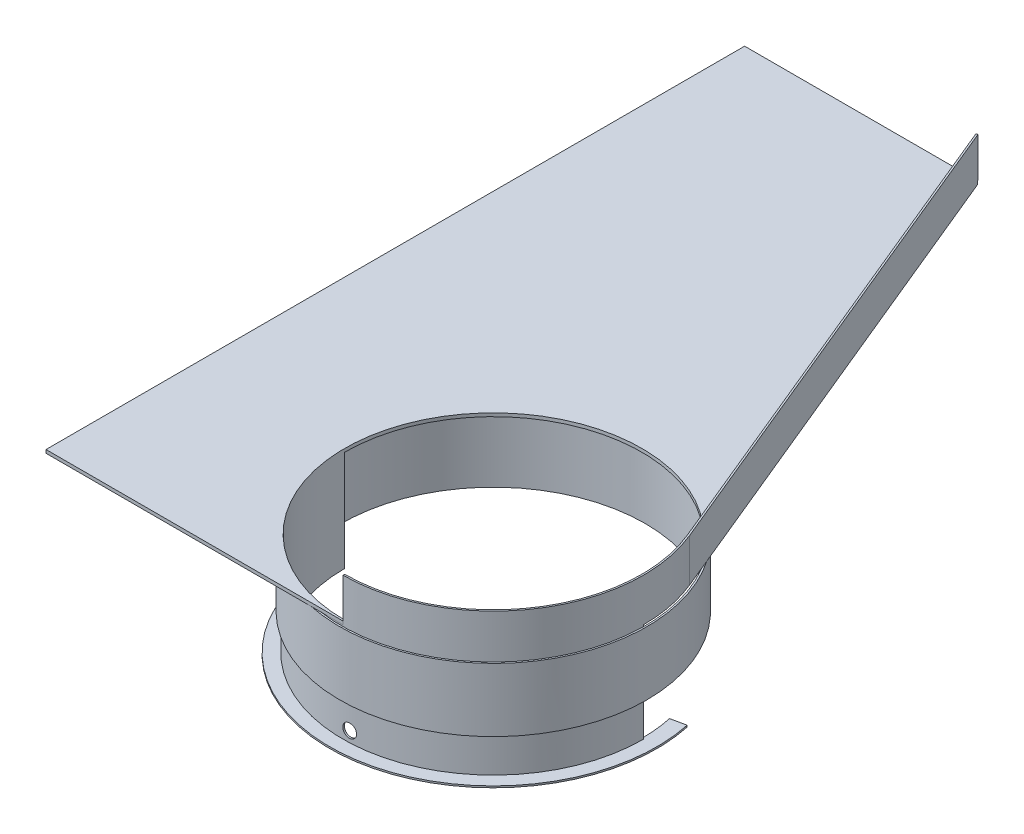
ISO-10303-21;
HEADER;
FILE_DESCRIPTION(('STEP AP214'),'2;1');
FILE_NAME('part.step','',(''),(''),'','','');
FILE_SCHEMA(('AUTOMOTIVE_DESIGN { 1 0 10303 214 1 1 1 1 }'));
ENDSEC;
DATA;
#1=APPLICATION_CONTEXT('core data for automotive mechanical design processes');
#2=APPLICATION_PROTOCOL_DEFINITION('international standard','automotive_design',2000,#1);
#3=PRODUCT_CONTEXT('',#1,'mechanical');
#4=PRODUCT('Part','Part','',(#3));
#5=PRODUCT_RELATED_PRODUCT_CATEGORY('part','',(#4));
#6=PRODUCT_DEFINITION_FORMATION('','',#4);
#7=PRODUCT_DEFINITION_CONTEXT('part definition',#1,'design');
#8=PRODUCT_DEFINITION('design','',#6,#7);
#9=PRODUCT_DEFINITION_SHAPE('','',#8);
#10=(LENGTH_UNIT() NAMED_UNIT(*) SI_UNIT(.MILLI.,.METRE.));
#11=(NAMED_UNIT(*) PLANE_ANGLE_UNIT() SI_UNIT($,.RADIAN.));
#12=(NAMED_UNIT(*) SI_UNIT($,.STERADIAN.) SOLID_ANGLE_UNIT());
#13=UNCERTAINTY_MEASURE_WITH_UNIT(LENGTH_MEASURE(1.E-05),#10,'distance_accuracy_value','');
#14=(GEOMETRIC_REPRESENTATION_CONTEXT(3) GLOBAL_UNCERTAINTY_ASSIGNED_CONTEXT((#13)) GLOBAL_UNIT_ASSIGNED_CONTEXT((#10,
#11,#12)) REPRESENTATION_CONTEXT('',''));
#15=CARTESIAN_POINT('',(0.,0.,0.));
#16=DIRECTION('',(0.,0.,1.));
#17=DIRECTION('',(1.,0.,0.));
#18=AXIS2_PLACEMENT_3D('',#15,#16,#17);
#19=CARTESIAN_POINT('',(0.,98.425,0.));
#20=DIRECTION('',(0.,-1.,0.));
#21=DIRECTION('',(0.,0.,-1.));
#22=AXIS2_PLACEMENT_3D('',#19,#20,#21);
#23=PLANE('',#22);
#24=DIRECTION('',(0.381936464594125,0.,0.924188583035595));
#25=VECTOR('',#24,1.);
#26=CARTESIAN_POINT('',(240.88481378643,98.425,-99.5496978006486));
#27=LINE('',#26,#25);
#28=CARTESIAN_POINT('',(135.067723015778,98.425,-355.600000000001));
#29=VERTEX_POINT('',#28);
#30=CARTESIAN_POINT('',(318.446478633084,98.425,88.1296985845215));
#31=VERTEX_POINT('',#30);
#32=EDGE_CURVE('E336',#29,#31,#27,.T.);
#33=ORIENTED_EDGE('',*,*,#32,.T.);
#34=CARTESIAN_POINT('',(196.567199105005,98.425,171.45));
#35=DIRECTION('',(0.,-1.,0.));
#36=DIRECTION('',(1.,0.,0.));
#37=AXIS2_PLACEMENT_3D('',#34,#35,#36);
#38=CIRCLE('',#37,147.6375);
#39=CARTESIAN_POINT('',(166.113668931969,98.425,315.9125));
#40=VERTEX_POINT('',#39);
#41=EDGE_CURVE('E392',#40,#31,#38,.T.);
#42=ORIENTED_EDGE('',*,*,#41,.F.);
#43=DIRECTION('',(-1.,0.,0.));
#44=VECTOR('',#43,1.);
#45=CARTESIAN_POINT('',(0.,98.425,315.9125));
#46=LINE('',#45,#44);
#47=CARTESIAN_POINT('',(-88.9,98.425,315.9125));
#48=VERTEX_POINT('',#47);
#49=EDGE_CURVE('E113',#40,#48,#46,.T.);
#50=ORIENTED_EDGE('',*,*,#49,.T.);
#51=DIRECTION('',(0.,0.,1.));
#52=VECTOR('',#51,1.);
#53=CARTESIAN_POINT('',(-88.9,98.425,0.));
#54=LINE('',#53,#52);
#55=CARTESIAN_POINT('',(-88.9,98.425,-355.6));
#56=VERTEX_POINT('',#55);
#57=EDGE_CURVE('E449',#56,#48,#54,.T.);
#58=ORIENTED_EDGE('',*,*,#57,.F.);
#59=DIRECTION('',(-1.,0.,0.));
#60=VECTOR('',#59,1.);
#61=CARTESIAN_POINT('',(-88.9,98.425,-355.6));
#62=LINE('',#61,#60);
#63=EDGE_CURVE('E451',#29,#56,#62,.T.);
#64=ORIENTED_EDGE('',*,*,#63,.F.);
#65=EDGE_LOOP('',(#33,#42,#50,#58,#64));
#66=FACE_BOUND('',#65,.T.);
#67=ADVANCED_FACE('F51',(#66),#23,.T.);
#68=CARTESIAN_POINT('',(0.,101.6,0.));
#69=DIRECTION('',(0.,-1.,0.));
#70=DIRECTION('',(0.,0.,-1.));
#71=AXIS2_PLACEMENT_3D('',#68,#69,#70);
#72=PLANE('',#71);
#73=DIRECTION('',(0.,0.,1.));
#74=VECTOR('',#73,1.);
#75=CARTESIAN_POINT('',(-88.9,101.6,0.));
#76=LINE('',#75,#74);
#77=CARTESIAN_POINT('',(-88.9,101.6,-355.6));
#78=VERTEX_POINT('',#77);
#79=CARTESIAN_POINT('',(-88.9,101.6,315.9125));
#80=VERTEX_POINT('',#79);
#81=EDGE_CURVE('E439',#78,#80,#76,.T.);
#82=ORIENTED_EDGE('',*,*,#81,.T.);
#83=DIRECTION('',(-1.,0.,0.));
#84=VECTOR('',#83,1.);
#85=CARTESIAN_POINT('',(0.,101.6,315.9125));
#86=LINE('',#85,#84);
#87=CARTESIAN_POINT('',(196.567199105005,101.6,315.9125));
#88=VERTEX_POINT('',#87);
#89=EDGE_CURVE('E206',#88,#80,#86,.T.);
#90=ORIENTED_EDGE('',*,*,#89,.F.);
#91=DIRECTION('',(0.,0.,-1.));
#92=VECTOR('',#91,1.);
#93=CARTESIAN_POINT('',(196.567199105005,101.6,315.9125));
#94=LINE('',#93,#92);
#95=CARTESIAN_POINT('',(196.567199105005,101.6,314.325));
#96=VERTEX_POINT('',#95);
#97=EDGE_CURVE('E434',#88,#96,#94,.T.);
#98=ORIENTED_EDGE('',*,*,#97,.T.);
#99=CARTESIAN_POINT('',(196.567199105005,101.6,171.45));
#100=DIRECTION('',(0.,1.,0.));
#101=DIRECTION('',(0.,0.,1.));
#102=AXIS2_PLACEMENT_3D('',#99,#100,#101);
#103=CIRCLE('',#102,142.875);
#104=CARTESIAN_POINT('',(328.610642906215,101.6,116.880827621114));
#105=VERTEX_POINT('',#104);
#106=EDGE_CURVE('E404',#105,#96,#103,.T.);
#107=ORIENTED_EDGE('',*,*,#106,.F.);
#108=DIRECTION('',(0.381936464594125,0.,0.924188583035595));
#109=VECTOR('',#108,1.);
#110=CARTESIAN_POINT('',(328.610642906215,101.6,116.880827621114));
#111=LINE('',#110,#109);
#112=CARTESIAN_POINT('',(133.35,101.6,-355.6));
#113=VERTEX_POINT('',#112);
#114=EDGE_CURVE('E460',#113,#105,#111,.T.);
#115=ORIENTED_EDGE('',*,*,#114,.F.);
#116=DIRECTION('',(-1.,0.,0.));
#117=VECTOR('',#116,1.);
#118=CARTESIAN_POINT('',(-88.9,101.6,-355.6));
#119=LINE('',#118,#117);
#120=EDGE_CURVE('E438',#113,#78,#119,.T.);
#121=ORIENTED_EDGE('',*,*,#120,.T.);
#122=EDGE_LOOP('',(#82,#90,#98,#107,#115,#121));
#123=FACE_BOUND('',#122,.T.);
#124=ADVANCED_FACE('F240',(#123),#72,.F.);
#125=CARTESIAN_POINT('',(-88.9,101.6,-355.6));
#126=DIRECTION('',(0.,0.,1.));
#127=DIRECTION('',(1.,0.,0.));
#128=AXIS2_PLACEMENT_3D('',#125,#126,#127);
#129=PLANE('',#128);
#130=CARTESIAN_POINT('',(135.067723015778,101.6,-355.600000000001));
#131=VERTEX_POINT('',#130);
#132=EDGE_CURVE('E456',#131,#113,#119,.T.);
#133=ORIENTED_EDGE('',*,*,#132,.F.);
#134=DIRECTION('',(0.,1.,0.));
#135=VECTOR('',#134,1.);
#136=CARTESIAN_POINT('',(135.067723015778,98.425,-355.600000000001));
#137=LINE('',#136,#135);
#138=EDGE_CURVE('E389',#29,#131,#137,.T.);
#139=ORIENTED_EDGE('',*,*,#138,.F.);
#140=ORIENTED_EDGE('',*,*,#63,.T.);
#141=DIRECTION('',(0.,-1.,0.));
#142=VECTOR('',#141,1.);
#143=CARTESIAN_POINT('',(-88.9,101.6,-355.6));
#144=LINE('',#143,#142);
#145=EDGE_CURVE('E372',#78,#56,#144,.T.);
#146=ORIENTED_EDGE('',*,*,#145,.F.);
#147=ORIENTED_EDGE('',*,*,#120,.F.);
#148=EDGE_LOOP('',(#133,#139,#140,#146,#147));
#149=FACE_BOUND('',#148,.T.);
#150=ADVANCED_FACE('F276',(#149),#129,.F.);
#151=CARTESIAN_POINT('',(-88.9,101.6,0.));
#152=DIRECTION('',(1.,0.,0.));
#153=DIRECTION('',(0.,0.,-1.));
#154=AXIS2_PLACEMENT_3D('',#151,#152,#153);
#155=PLANE('',#154);
#156=ORIENTED_EDGE('',*,*,#57,.T.);
#157=DIRECTION('',(0.,1.,0.));
#158=VECTOR('',#157,1.);
#159=CARTESIAN_POINT('',(-88.9,98.425,315.9125));
#160=LINE('',#159,#158);
#161=EDGE_CURVE('E448',#48,#80,#160,.T.);
#162=ORIENTED_EDGE('',*,*,#161,.T.);
#163=ORIENTED_EDGE('',*,*,#81,.F.);
#164=ORIENTED_EDGE('',*,*,#145,.T.);
#165=EDGE_LOOP('',(#156,#162,#163,#164));
#166=FACE_BOUND('',#165,.T.);
#167=ADVANCED_FACE('F281',(#166),#155,.F.);
#168=CARTESIAN_POINT('',(196.567199105005,98.425,171.45));
#169=DIRECTION('',(0.,-1.,0.));
#170=DIRECTION('',(0.,0.,-1.));
#171=AXIS2_PLACEMENT_3D('',#168,#169,#170);
#172=CIRCLE('',#171,146.05);
#173=CARTESIAN_POINT('',(175.091897157185,98.425,315.9125));
#174=VERTEX_POINT('',#173);
#175=CARTESIAN_POINT('',(321.875591379743,98.425,96.4272746061546));
#176=VERTEX_POINT('',#175);
#177=EDGE_CURVE('E365',#174,#176,#172,.T.);
#178=ORIENTED_EDGE('',*,*,#177,.T.);
#179=CARTESIAN_POINT('',(330.077792281784,98.425,116.274503483571));
#180=VERTEX_POINT('',#179);
#181=EDGE_CURVE('E367',#176,#180,#27,.T.);
#182=ORIENTED_EDGE('',*,*,#181,.T.);
#183=CARTESIAN_POINT('',(196.567199105005,98.425,171.45));
#184=DIRECTION('',(0.,1.,0.));
#185=DIRECTION('',(0.,0.,1.));
#186=AXIS2_PLACEMENT_3D('',#183,#184,#185);
#187=CIRCLE('',#186,144.4625);
#188=CARTESIAN_POINT('',(341.029699105005,98.425,171.45));
#189=VERTEX_POINT('',#188);
#190=EDGE_CURVE('E193',#180,#189,#187,.F.);
#191=ORIENTED_EDGE('',*,*,#190,.T.);
#192=DIRECTION('',(-1.,0.,0.));
#193=VECTOR('',#192,1.);
#194=CARTESIAN_POINT('',(339.442199105005,98.425,171.45));
#195=LINE('',#194,#193);
#196=CARTESIAN_POINT('',(339.442199105005,98.425,171.45));
#197=VERTEX_POINT('',#196);
#198=EDGE_CURVE('E191',#189,#197,#195,.T.);
#199=ORIENTED_EDGE('',*,*,#198,.T.);
#200=CARTESIAN_POINT('',(196.567199105005,98.425,171.45));
#201=DIRECTION('',(0.,-1.,0.));
#202=DIRECTION('',(0.,0.,-1.));
#203=AXIS2_PLACEMENT_3D('',#200,#201,#202);
#204=CIRCLE('',#203,142.875);
#205=CARTESIAN_POINT('',(53.692199105005,98.425,171.449994621471));
#206=VERTEX_POINT('',#205);
#207=EDGE_CURVE('E190',#206,#197,#204,.T.);
#208=ORIENTED_EDGE('',*,*,#207,.F.);
#209=DIRECTION('',(-0.999999999999999,0.,-3.7437000131595E-08));
#210=VECTOR('',#209,1.);
#211=CARTESIAN_POINT('',(52.1046991050048,98.425,171.449994591755));
#212=LINE('',#211,#210);
#213=CARTESIAN_POINT('',(52.1046991050048,98.425,171.449994591755));
#214=VERTEX_POINT('',#213);
#215=EDGE_CURVE('E173',#206,#214,#212,.T.);
#216=ORIENTED_EDGE('',*,*,#215,.T.);
#217=CARTESIAN_POINT('',(196.567199105005,98.425,171.45));
#218=DIRECTION('',(0.,-1.,0.));
#219=DIRECTION('',(0.,0.,-1.));
#220=AXIS2_PLACEMENT_3D('',#217,#218,#219);
#221=CIRCLE('',#220,144.4625);
#222=CARTESIAN_POINT('',(196.567199105005,98.425,315.9125));
#223=VERTEX_POINT('',#222);
#224=EDGE_CURVE('E163',#214,#223,#221,.F.);
#225=ORIENTED_EDGE('',*,*,#224,.T.);
#226=EDGE_CURVE('E172',#223,#174,#46,.T.);
#227=ORIENTED_EDGE('',*,*,#226,.T.);
#228=EDGE_LOOP('',(#178,#182,#191,#199,#208,#216,#225,#227));
#229=FACE_BOUND('',#228,.T.);
#230=ADVANCED_FACE('F188',(#229),#23,.T.);
#231=CARTESIAN_POINT('',(196.567199105005,88.9,171.45));
#232=DIRECTION('',(0.,1.,0.));
#233=DIRECTION('',(0.,0.,1.));
#234=AXIS2_PLACEMENT_3D('',#231,#232,#233);
#235=CYLINDRICAL_SURFACE('',#234,142.875);
#236=CARTESIAN_POINT('',(196.567199105005,11.6261879746493,314.325));
#237=CARTESIAN_POINT('',(196.615253896574,11.4543548186779,314.32499990202));
#238=CARTESIAN_POINT('',(196.670554967419,11.2845709907114,314.324976209914));
#239=CARTESIAN_POINT('',(196.795278415329,10.9502090413723,314.324831577827));
#240=CARTESIAN_POINT('',(196.864704462244,10.7856322857303,314.324710612551));
#241=CARTESIAN_POINT('',(197.017236361738,10.4627711907513,314.324311574846));
#242=CARTESIAN_POINT('',(197.100354220955,10.3044925269535,314.324033363999));
#243=CARTESIAN_POINT('',(197.279664562586,9.99544521606388,314.323251713896));
#244=CARTESIAN_POINT('',(197.375861819563,9.84467933906556,314.322748192238));
#245=CARTESIAN_POINT('',(197.580529954451,9.55191927755886,314.321443068877));
#246=CARTESIAN_POINT('',(197.688990101966,9.40991758979101,314.320641726393));
#247=CARTESIAN_POINT('',(197.917520124459,9.13549939651927,314.318664569011));
#248=CARTESIAN_POINT('',(198.037594264975,9.00308644418662,314.317488616161));
#249=CARTESIAN_POINT('',(198.288385479252,8.74892116851178,314.314687218716));
#250=CARTESIAN_POINT('',(198.419095984895,8.62716236105149,314.313062050056));
#251=CARTESIAN_POINT('',(198.690343912275,8.39503475406785,314.309288394543));
#252=CARTESIAN_POINT('',(198.830884943181,8.2846701750202,314.307139714763));
#253=CARTESIAN_POINT('',(199.120768796066,8.0761532485125,314.302252061505));
#254=CARTESIAN_POINT('',(199.270112708013,7.97800241805445,314.299513014816));
#255=CARTESIAN_POINT('',(199.576580221628,7.79459310467274,314.293385372661));
#256=CARTESIAN_POINT('',(199.73370667698,7.70933939799085,314.289996537606));
#257=CARTESIAN_POINT('',(200.054515414621,7.55240172418231,314.282524240668));
#258=CARTESIAN_POINT('',(200.21819549498,7.48071324491497,314.278441010621));
#259=CARTESIAN_POINT('',(200.55105606119,7.35135831784106,314.269544304146));
#260=CARTESIAN_POINT('',(200.720238554011,7.29369705289759,314.264730558867));
#261=CARTESIAN_POINT('',(201.062688956795,7.19288829058657,314.254360961581));
#262=CARTESIAN_POINT('',(201.235953107408,7.14972795673062,314.248805772034));
#263=CARTESIAN_POINT('',(201.58553798195,7.07814476414547,314.236947954508));
#264=CARTESIAN_POINT('',(201.761859810735,7.04972735230271,314.230645051335));
#265=CARTESIAN_POINT('',(202.116190406978,7.0078696639013,314.217313165089));
#266=CARTESIAN_POINT('',(202.294198515191,6.99442375971811,314.210284455924));
#267=CARTESIAN_POINT('',(202.650703973123,6.98256872528322,314.195537706727));
#268=CARTESIAN_POINT('',(202.829201479146,6.98416514600313,314.187819413263));
#269=CARTESIAN_POINT('',(203.363090660613,7.01156359517123,314.163726099713));
#270=CARTESIAN_POINT('',(203.717557146258,7.05989536943355,314.146387132037));
#271=CARTESIAN_POINT('',(204.413044190085,7.21537734872768,314.109840050414));
#272=CARTESIAN_POINT('',(204.754064758873,7.32252750736841,314.090631937942));
#273=CARTESIAN_POINT('',(205.413305440998,7.59260163399402,314.051266045496));
#274=CARTESIAN_POINT('',(205.731522343889,7.75553343669405,314.031108132462));
#275=CARTESIAN_POINT('',(206.336057088769,8.13254424384942,313.990965984652));
#276=CARTESIAN_POINT('',(206.622374705606,8.34662360928075,313.970981751104));
#277=CARTESIAN_POINT('',(207.155295613449,8.82007530870277,313.932382820148));
#278=CARTESIAN_POINT('',(207.401863771044,9.07948729348884,313.913769342118));
#279=CARTESIAN_POINT('',(207.8480194287,9.63612849136741,313.879136543206));
#280=CARTESIAN_POINT('',(208.04760687057,9.93335775130072,313.863117225535));
#281=CARTESIAN_POINT('',(208.394206577394,10.5572930902223,313.834753017542));
#282=CARTESIAN_POINT('',(208.541205768417,10.8840064739941,313.822409041071));
#283=CARTESIAN_POINT('',(208.778391878095,11.5575746296652,313.802262577657));
#284=CARTESIAN_POINT('',(208.868579093196,11.9044292964564,313.794460067016));
#285=CARTESIAN_POINT('',(208.989532562772,12.6081481264821,313.783955857628));
#286=CARTESIAN_POINT('',(209.020344620702,12.9650043584718,313.781250227058));
#287=CARTESIAN_POINT('',(209.021810421834,13.6788403824037,313.781121978639));
#288=CARTESIAN_POINT('',(208.992464405041,14.0358201738472,313.783699339715));
#289=CARTESIAN_POINT('',(208.874483762337,14.7395512389076,313.793949014821));
#290=CARTESIAN_POINT('',(208.785883965813,15.0863083964483,313.801618335776));
#291=CARTESIAN_POINT('',(208.551942235534,15.7599836824946,313.821504317867));
#292=CARTESIAN_POINT('',(208.406600096663,16.0869017392794,313.833720995441));
#293=CARTESIAN_POINT('',(208.063193344783,16.7118068593138,313.861858024435));
#294=CARTESIAN_POINT('',(207.865101652333,17.0097789553709,313.877780277614));
#295=CARTESIAN_POINT('',(207.421819609689,17.5681727591262,313.912248018469));
#296=CARTESIAN_POINT('',(207.176629005475,17.828594264289,313.930793520294));
#297=CARTESIAN_POINT('',(206.645842132196,18.3047132175998,313.969322511855));
#298=CARTESIAN_POINT('',(206.360213178254,18.5203741361913,313.989307158317));
#299=CARTESIAN_POINT('',(205.756763361558,18.9005836214028,314.029482506636));
#300=CARTESIAN_POINT('',(205.438942522737,19.0651322260232,314.049673208339));
#301=CARTESIAN_POINT('',(204.780153979114,19.3384149138748,314.089131277148));
#302=CARTESIAN_POINT('',(204.439189889037,19.4471576907651,314.108398787647));
#303=CARTESIAN_POINT('',(203.743723179011,19.6057561925892,314.145074470658));
#304=CARTESIAN_POINT('',(203.389220654941,19.6556123344742,314.162482656334));
#305=CARTESIAN_POINT('',(202.677127628995,19.6950198228808,314.194742102891));
#306=CARTESIAN_POINT('',(202.319540121624,19.684624240496,314.209595602126));
#307=CARTESIAN_POINT('',(201.610897759349,19.6038576822615,314.236386732463));
#308=CARTESIAN_POINT('',(201.259842906369,19.5334866887479,314.248324362708));
#309=CARTESIAN_POINT('',(200.746141152713,19.3846699411106,314.263976040969));
#310=CARTESIAN_POINT('',(200.576985736101,19.3278213792947,314.268819030408));
#311=CARTESIAN_POINT('',(200.24405335878,19.2001020641655,314.277777399479));
#312=CARTESIAN_POINT('',(200.080274439788,19.1292364838571,314.281893046482));
#313=CARTESIAN_POINT('',(199.759195626977,18.9739506257005,314.289429475496));
#314=CARTESIAN_POINT('',(199.601898182947,18.8895252806906,314.292849996658));
#315=CARTESIAN_POINT('',(199.295004814628,18.7077711430126,314.299040050261));
#316=CARTESIAN_POINT('',(199.14540607988,18.6104471061466,314.301809821597));
#317=CARTESIAN_POINT('',(198.854744930506,18.4034416698158,314.306760140403));
#318=CARTESIAN_POINT('',(198.713692668414,18.2937459997217,314.308939997354));
#319=CARTESIAN_POINT('',(198.441367044184,18.0629109522437,314.312772130168));
#320=CARTESIAN_POINT('',(198.310090101033,17.9417758027608,314.314424599966));
#321=CARTESIAN_POINT('',(198.058149738643,17.688844179913,314.317276071239));
#322=CARTESIAN_POINT('',(197.937489880642,17.5570441575233,314.318474921001));
#323=CARTESIAN_POINT('',(197.707735053015,17.2838031548061,314.32049380599));
#324=CARTESIAN_POINT('',(197.598635832973,17.142365749431,314.321313980816));
#325=CARTESIAN_POINT('',(197.392642096391,16.8506856492346,314.322652705662));
#326=CARTESIAN_POINT('',(197.295757948017,16.7004356306351,314.32317100078));
#327=CARTESIAN_POINT('',(197.115028313032,16.3923624576709,314.323978300038));
#328=CARTESIAN_POINT('',(197.031178025527,16.2345421199222,314.324267388766));
#329=CARTESIAN_POINT('',(196.877026135951,15.9122986167003,314.324684882939));
#330=CARTESIAN_POINT('',(196.806732848448,15.7478714734604,314.32481319004));
#331=CARTESIAN_POINT('',(196.680286924195,15.4137366500701,314.324969238635));
#332=CARTESIAN_POINT('',(196.624129067164,15.2440309454088,314.324997017305));
#333=CARTESIAN_POINT('',(196.526308471337,14.9004342846156,314.325002532549));
#334=CARTESIAN_POINT('',(196.484650276078,14.726542034827,314.324980253453));
#335=CARTESIAN_POINT('',(196.416165885381,14.3759279480662,314.324924277466));
#336=CARTESIAN_POINT('',(196.38933426003,14.1992071714116,314.324890584763));
#337=CARTESIAN_POINT('',(196.350690553954,13.844285040237,314.324837270959));
#338=CARTESIAN_POINT('',(196.338865304881,13.6660851221197,314.324817637529));
#339=CARTESIAN_POINT('',(196.330274751789,13.3093805914982,314.324803595567));
#340=CARTESIAN_POINT('',(196.33350553773,13.1308760701358,314.324809180485));
#341=CARTESIAN_POINT('',(196.357788260156,12.7286093778756,314.324847304898));
#342=CARTESIAN_POINT('',(196.383239203075,12.5050998918901,314.324886451063));
#343=CARTESIAN_POINT('',(196.45769908667,12.0620405016794,314.324962860281));
#344=CARTESIAN_POINT('',(196.506708001375,11.8424905930891,314.325000123336));
#345=CARTESIAN_POINT('',(196.567199105005,11.6261879746493,314.325));
#346=B_SPLINE_CURVE_WITH_KNOTS('',3,(#236,#237,#238,#239,#240,#241,#242,#243,#244,#245,#246,
#247,#248,#249,#250,#251,#252,#253,#254,#255,#256,#257,#258,#259,#260,#261,#262,#263,#264,#265,
#266,#267,#268,#269,#270,#271,#272,#273,#274,#275,#276,#277,#278,#279,#280,#281,#282,#283,#284,
#285,#286,#287,#288,#289,#290,#291,#292,#293,#294,#295,#296,#297,#298,#299,#300,#301,#302,#303,
#304,#305,#306,#307,#308,#309,#310,#311,#312,#313,#314,#315,#316,#317,#318,#319,#320,#321,#322,
#323,#324,#325,#326,#327,#328,#329,#330,#331,#332,#333,#334,#335,#336,#337,#338,#339,#340,#341,
#342,#343,#344,#345),.UNSPECIFIED.,.T.,.F.,(4,2,2,2,2,2,2,2,2,2,2,2,2,2,2,2,2,2,2,2,2,2,2,2,2,2,
2,2,2,2,2,2,2,2,2,2,2,2,2,2,2,2,2,2,2,2,2,2,2,2,2,2,2,2,4),(0.,0.535082122059147,
1.07030344325388,1.60599663449859,2.14188590525924,2.67730983389171,3.21293116287596,
3.74822421163769,4.28371482941534,4.81927189126852,5.35502680505504,5.89060319862229,
6.42637718077383,6.96167562868381,7.49717170615265,8.03246642853089,8.56795869498278,
9.63691931857001,10.7058790990506,11.7749890800797,12.8441066066185,13.9141639751156,
14.9842226690081,16.0545472049405,17.1248661558432,18.1943591053445,19.2638477880623,
20.3327083769567,21.4015728296848,22.4709870545895,23.5404070473442,24.6106964019881,
25.6809849609035,26.7511067352567,27.8212209324901,28.8903926920509,29.9595647665009,
30.4945998774421,31.029437899928,31.5644762535737,32.0993178822891,32.6347828833529,
33.170050751464,33.7054974828244,34.2407466622219,34.776447146111,35.3119498400462,
35.8477799230024,36.383411830108,36.9192114292256,37.4548146729517,37.9899475900271,
38.5249415412511,39.1985006749703,39.8720590661163),.UNSPECIFIED.);
#347=CARTESIAN_POINT('',(196.567199105005,11.6261879746493,314.325));
#348=VERTEX_POINT('',#347);
#349=EDGE_CURVE('E222',#348,#348,#346,.T.);
#350=ORIENTED_EDGE('',*,*,#349,.T.);
#351=EDGE_LOOP('',(#350));
#352=FACE_BOUND('',#351,.T.);
#353=ORIENTED_EDGE('',*,*,#207,.T.);
#354=DIRECTION('',(0.,-1.,0.));
#355=VECTOR('',#354,1.);
#356=CARTESIAN_POINT('',(339.442199105005,421.452972618204,171.45));
#357=LINE('',#356,#355);
#358=CARTESIAN_POINT('',(339.442199105005,3.175,171.45));
#359=VERTEX_POINT('',#358);
#360=EDGE_CURVE('E75',#197,#359,#357,.T.);
#361=ORIENTED_EDGE('',*,*,#360,.T.);
#362=CARTESIAN_POINT('',(196.567199105005,3.175,171.45));
#363=DIRECTION('',(0.,1.,0.));
#364=DIRECTION('',(0.,0.,1.));
#365=AXIS2_PLACEMENT_3D('',#362,#363,#364);
#366=CIRCLE('',#365,142.875);
#367=CARTESIAN_POINT('',(336.336220844135,3.175,141.820855782077));
#368=VERTEX_POINT('',#367);
#369=EDGE_CURVE('E333',#359,#368,#366,.T.);
#370=ORIENTED_EDGE('',*,*,#369,.T.);
#371=DIRECTION('',(0.,1.,0.));
#372=VECTOR('',#371,1.);
#373=CARTESIAN_POINT('',(336.336220844135,1.5875,141.820855782077));
#374=LINE('',#373,#372);
#375=CARTESIAN_POINT('',(336.336220844135,1.5875,141.820855782077));
#376=VERTEX_POINT('',#375);
#377=EDGE_CURVE('E329',#376,#368,#374,.T.);
#378=ORIENTED_EDGE('',*,*,#377,.F.);
#379=CARTESIAN_POINT('',(196.567199105005,1.5875,171.45));
#380=DIRECTION('',(0.,1.,0.));
#381=DIRECTION('',(0.,0.,1.));
#382=AXIS2_PLACEMENT_3D('',#379,#380,#381);
#383=CIRCLE('',#382,142.875);
#384=CARTESIAN_POINT('',(53.6921991050049,1.5875,171.449994651187));
#385=VERTEX_POINT('',#384);
#386=EDGE_CURVE('E315',#385,#376,#383,.T.);
#387=ORIENTED_EDGE('',*,*,#386,.F.);
#388=DIRECTION('',(0.,-1.,0.));
#389=VECTOR('',#388,1.);
#390=CARTESIAN_POINT('',(53.6921991050048,421.452972618204,171.449994651187));
#391=LINE('',#390,#389);
#392=EDGE_CURVE('E407',#206,#385,#391,.T.);
#393=ORIENTED_EDGE('',*,*,#392,.F.);
#394=EDGE_LOOP('',(#353,#361,#370,#378,#387,#393));
#395=FACE_BOUND('',#394,.T.);
#396=ORIENTED_EDGE('',*,*,#106,.T.);
#397=DIRECTION('',(0.,-1.,0.));
#398=VECTOR('',#397,1.);
#399=CARTESIAN_POINT('',(196.567199105005,139.7,314.325));
#400=LINE('',#399,#398);
#401=CARTESIAN_POINT('',(196.567199105005,139.7,314.325));
#402=VERTEX_POINT('',#401);
#403=EDGE_CURVE('E418',#402,#96,#400,.T.);
#404=ORIENTED_EDGE('',*,*,#403,.F.);
#405=CARTESIAN_POINT('',(196.567199105005,139.7,171.45));
#406=DIRECTION('',(0.,-1.,0.));
#407=DIRECTION('',(0.,0.,-1.));
#408=AXIS2_PLACEMENT_3D('',#405,#406,#407);
#409=CIRCLE('',#408,142.875);
#410=CARTESIAN_POINT('',(328.610642906215,139.7,116.880827621114));
#411=VERTEX_POINT('',#410);
#412=EDGE_CURVE('E411',#411,#402,#409,.T.);
#413=ORIENTED_EDGE('',*,*,#412,.F.);
#414=DIRECTION('',(0.,-1.,0.));
#415=VECTOR('',#414,1.);
#416=CARTESIAN_POINT('',(328.610642906215,139.7,116.880827621114));
#417=LINE('',#416,#415);
#418=EDGE_CURVE('E419',#411,#105,#417,.T.);
#419=ORIENTED_EDGE('',*,*,#418,.T.);
#420=EDGE_LOOP('',(#396,#404,#413,#419));
#421=FACE_BOUND('',#420,.T.);
#422=ADVANCED_FACE('F233',(#352,#395,#421),#235,.F.);
#423=CARTESIAN_POINT('',(196.567199105005,139.7,315.9125));
#424=DIRECTION('',(-1.,0.,0.));
#425=DIRECTION('',(0.,0.,1.));
#426=AXIS2_PLACEMENT_3D('',#423,#424,#425);
#427=PLANE('',#426);
#428=ORIENTED_EDGE('',*,*,#97,.F.);
#429=DIRECTION('',(0.,-1.,0.));
#430=VECTOR('',#429,1.);
#431=CARTESIAN_POINT('',(196.567199105005,139.7,315.9125));
#432=LINE('',#431,#430);
#433=CARTESIAN_POINT('',(196.567199105005,139.7,315.9125));
#434=VERTEX_POINT('',#433);
#435=EDGE_CURVE('E185',#434,#88,#432,.T.);
#436=ORIENTED_EDGE('',*,*,#435,.F.);
#437=DIRECTION('',(0.,0.,-1.));
#438=VECTOR('',#437,1.);
#439=CARTESIAN_POINT('',(196.567199105005,139.7,315.9125));
#440=LINE('',#439,#438);
#441=EDGE_CURVE('E415',#434,#402,#440,.T.);
#442=ORIENTED_EDGE('',*,*,#441,.T.);
#443=ORIENTED_EDGE('',*,*,#403,.T.);
#444=EDGE_LOOP('',(#428,#436,#442,#443));
#445=FACE_BOUND('',#444,.T.);
#446=ADVANCED_FACE('F238',(#445),#427,.T.);
#447=CARTESIAN_POINT('',(196.567199105005,139.7,171.45));
#448=DIRECTION('',(0.,-1.,0.));
#449=DIRECTION('',(0.,0.,-1.));
#450=AXIS2_PLACEMENT_3D('',#447,#448,#449);
#451=CYLINDRICAL_SURFACE('',#450,144.4625);
#452=ORIENTED_EDGE('',*,*,#435,.T.);
#453=DIRECTION('',(0.,1.,0.));
#454=VECTOR('',#453,1.);
#455=CARTESIAN_POINT('',(196.567199105005,98.425,315.9125));
#456=LINE('',#455,#454);
#457=EDGE_CURVE('E169',#223,#88,#456,.T.);
#458=ORIENTED_EDGE('',*,*,#457,.F.);
#459=ORIENTED_EDGE('',*,*,#224,.F.);
#460=DIRECTION('',(0.,-1.,0.));
#461=VECTOR('',#460,1.);
#462=CARTESIAN_POINT('',(52.1046991050048,421.452972618204,171.449994591755));
#463=LINE('',#462,#461);
#464=CARTESIAN_POINT('',(52.1046991050048,3.175,171.449994591755));
#465=VERTEX_POINT('',#464);
#466=EDGE_CURVE('E168',#214,#465,#463,.T.);
#467=ORIENTED_EDGE('',*,*,#466,.T.);
#468=CARTESIAN_POINT('',(196.567199105005,3.175,171.45));
#469=DIRECTION('',(0.,1.,0.));
#470=DIRECTION('',(1.,0.,0.));
#471=AXIS2_PLACEMENT_3D('',#468,#469,#470);
#472=CIRCLE('',#471,144.4625);
#473=CARTESIAN_POINT('',(341.029699105005,3.17499999999998,171.45));
#474=VERTEX_POINT('',#473);
#475=EDGE_CURVE('E12',#474,#465,#472,.F.);
#476=ORIENTED_EDGE('',*,*,#475,.F.);
#477=DIRECTION('',(0.,-1.,0.));
#478=VECTOR('',#477,1.);
#479=CARTESIAN_POINT('',(341.029699105005,421.452972618204,171.45));
#480=LINE('',#479,#478);
#481=EDGE_CURVE('E207',#189,#474,#480,.T.);
#482=ORIENTED_EDGE('',*,*,#481,.F.);
#483=ORIENTED_EDGE('',*,*,#190,.F.);
#484=DIRECTION('',(0.,-1.,0.));
#485=VECTOR('',#484,1.);
#486=CARTESIAN_POINT('',(330.077792281784,139.7,116.274503483571));
#487=LINE('',#486,#485);
#488=CARTESIAN_POINT('',(330.077792281784,139.7,116.274503483571));
#489=VERTEX_POINT('',#488);
#490=EDGE_CURVE('E380',#489,#180,#487,.T.);
#491=ORIENTED_EDGE('',*,*,#490,.F.);
#492=CARTESIAN_POINT('',(196.567199105005,139.7,171.45));
#493=DIRECTION('',(0.,1.,0.));
#494=DIRECTION('',(1.,0.,0.));
#495=AXIS2_PLACEMENT_3D('',#492,#493,#494);
#496=CIRCLE('',#495,144.4625);
#497=EDGE_CURVE('E184',#489,#434,#496,.F.);
#498=ORIENTED_EDGE('',*,*,#497,.T.);
#499=EDGE_LOOP('',(#452,#458,#459,#467,#476,#482,#483,#491,#498));
#500=FACE_BOUND('',#499,.T.);
#501=CARTESIAN_POINT('',(209.089110258958,13.335,315.368781426548));
#502=CARTESIAN_POINT('',(209.08911161733,13.5133126563791,315.368781201099));
#503=CARTESIAN_POINT('',(209.081617556221,13.6916032058707,315.369433903414));
#504=CARTESIAN_POINT('',(209.051693939695,14.0469752714199,315.372032809654));
#505=CARTESIAN_POINT('',(209.029260521907,14.2240564628501,315.373979348083));
#506=CARTESIAN_POINT('',(208.969586071743,14.5758435065958,315.379133943352));
#507=CARTESIAN_POINT('',(208.93233211775,14.7505471481605,315.382343101008));
#508=CARTESIAN_POINT('',(208.843265905141,15.0962452980601,315.389966954657));
#509=CARTESIAN_POINT('',(208.791448325296,15.2672384260091,315.394382091271));
#510=CARTESIAN_POINT('',(208.673680234371,15.6040850507306,315.404334796562));
#511=CARTESIAN_POINT('',(208.607742069116,15.7699428932865,315.40987138451));
#512=CARTESIAN_POINT('',(208.462146661816,16.0955581600795,315.421974576517));
#513=CARTESIAN_POINT('',(208.382484370223,16.2553133124148,315.428541559612));
#514=CARTESIAN_POINT('',(208.210074356102,16.5674298684932,315.442586038654));
#515=CARTESIAN_POINT('',(208.11733462874,16.719795713919,315.450062977902));
#516=CARTESIAN_POINT('',(207.919351853678,17.0162136284734,315.465806058665));
#517=CARTESIAN_POINT('',(207.814104200645,17.1602626062015,315.474072490645));
#518=CARTESIAN_POINT('',(207.591838599608,17.4390127783611,315.491256777845));
#519=CARTESIAN_POINT('',(207.474816664297,17.5737107798526,315.500174853458));
#520=CARTESIAN_POINT('',(207.229813565826,17.8327984112615,315.518517208684));
#521=CARTESIAN_POINT('',(207.101828371064,17.9571842156202,315.527941674035));
#522=CARTESIAN_POINT('',(206.835884037719,18.1946702422188,315.547140079186));
#523=CARTESIAN_POINT('',(206.697928188476,18.3077741573349,315.5569139032));
#524=CARTESIAN_POINT('',(206.412927389316,18.5219797887714,315.576666333446));
#525=CARTESIAN_POINT('',(206.26587910276,18.6230770588035,315.586645013946));
#526=CARTESIAN_POINT('',(205.963775355292,18.8125039074098,315.606654966857));
#527=CARTESIAN_POINT('',(205.808719744733,18.9008332472495,315.616686240247));
#528=CARTESIAN_POINT('',(205.491647359778,19.0641231557323,315.636661579979));
#529=CARTESIAN_POINT('',(205.329628034901,19.1390787735355,315.646605612736));
#530=CARTESIAN_POINT('',(204.999875802591,19.2750211909916,315.66626505623));
#531=CARTESIAN_POINT('',(204.832145057572,19.3360132113469,315.67598055119));
#532=CARTESIAN_POINT('',(204.492103229406,19.4436468501705,315.69506544747));
#533=CARTESIAN_POINT('',(204.319790479381,19.4902831664223,315.704434719793));
#534=CARTESIAN_POINT('',(203.798155966058,19.6079943248812,315.731834152268));
#535=CARTESIAN_POINT('',(203.443561155261,19.6571085292139,315.749190617917));
#536=CARTESIAN_POINT('',(202.731241286892,19.6950131457621,315.781375127397));
#537=CARTESIAN_POINT('',(202.373516249663,19.6838039496829,315.796203187646));
#538=CARTESIAN_POINT('',(201.665117354364,19.6014898781222,315.82295668163));
#539=CARTESIAN_POINT('',(201.314438795539,19.5304263885894,315.834884113648));
#540=CARTESIAN_POINT('',(200.629898036525,19.3304642229234,315.855767754607));
#541=CARTESIAN_POINT('',(200.296035895018,19.2015653449892,315.86472395318));
#542=CARTESIAN_POINT('',(199.654474133641,18.8895496371809,315.87986444128));
#543=CARTESIAN_POINT('',(199.346783682603,18.7064139061764,315.88604776259));
#544=CARTESIAN_POINT('',(198.766429812766,18.2911354008217,315.896051065668));
#545=CARTESIAN_POINT('',(198.49376658199,18.0589923634249,315.899871034752));
#546=CARTESIAN_POINT('',(197.990992687894,17.55205521051,315.905702996058));
#547=CARTESIAN_POINT('',(197.760918215332,17.2772251821245,315.907713456162));
#548=CARTESIAN_POINT('',(197.350160443015,16.692841678643,315.910524735083));
#549=CARTESIAN_POINT('',(197.169477154315,16.3832881957741,315.91132555363));
#550=CARTESIAN_POINT('',(196.862659082209,15.7382235405795,315.912279732337));
#551=CARTESIAN_POINT('',(196.736525595125,15.4027117516033,315.912433077111));
#552=CARTESIAN_POINT('',(196.542430486953,14.7152640556834,315.912530759879));
#553=CARTESIAN_POINT('',(196.474468527572,14.3633282442652,315.912475099088));
#554=CARTESIAN_POINT('',(196.398701102092,13.6533380699762,315.912406807224));
#555=CARTESIAN_POINT('',(196.390845343533,13.2952890736692,315.912394140181));
#556=CARTESIAN_POINT('',(196.435383404721,12.5829590514225,315.91244151225));
#557=CARTESIAN_POINT('',(196.487777071229,12.2286780159018,315.912501551177));
#558=CARTESIAN_POINT('',(196.651276684503,11.5340814401874,315.912498411412));
#559=CARTESIAN_POINT('',(196.76235967247,11.1937604949788,315.912435280877));
#560=CARTESIAN_POINT('',(197.04004461067,10.5365782410507,315.911792490089));
#561=CARTESIAN_POINT('',(197.20664680808,10.2197170367841,315.911212827537));
#562=CARTESIAN_POINT('',(197.590746218877,9.61821748106114,315.90900119888));
#563=CARTESIAN_POINT('',(197.808277216824,9.33360070633241,315.90736853298));
#564=CARTESIAN_POINT('',(198.287983359284,8.80488629934874,315.902449570223));
#565=CARTESIAN_POINT('',(198.550158728217,8.5607888707905,315.899163265053));
#566=CARTESIAN_POINT('',(199.111893702311,8.11987321926981,315.890358822729));
#567=CARTESIAN_POINT('',(199.411478739831,7.92308742917179,315.884839161489));
#568=CARTESIAN_POINT('',(200.039390974786,7.58260466274093,315.871107311448));
#569=CARTESIAN_POINT('',(200.367718068421,7.43890749469341,315.862895132371));
#570=CARTESIAN_POINT('',(201.043586081264,7.20873071429529,315.843525248253));
#571=CARTESIAN_POINT('',(201.391119952993,7.12223026401584,315.83236861801));
#572=CARTESIAN_POINT('',(202.095868998154,7.00886057087877,315.807097839131));
#573=CARTESIAN_POINT('',(202.453084133344,6.98199109251064,315.792983702174));
#574=CARTESIAN_POINT('',(202.987895509741,6.98691243449996,315.769855678957));
#575=CARTESIAN_POINT('',(203.166017849904,6.99609413441668,315.761819164319));
#576=CARTESIAN_POINT('',(203.52081113089,7.02942426569202,315.745157960773));
#577=CARTESIAN_POINT('',(203.697482583602,7.05356716655726,315.736533490253));
#578=CARTESIAN_POINT('',(204.048189062902,7.11666558906873,315.718775443058));
#579=CARTESIAN_POINT('',(204.222223088763,7.15562659376368,315.709641679));
#580=CARTESIAN_POINT('',(204.566305431129,7.24806193379855,315.69097154262));
#581=CARTESIAN_POINT('',(204.736355192007,7.30153091842593,315.681435319822));
#582=CARTESIAN_POINT('',(205.071389823516,7.42263113542992,315.662068908149));
#583=CARTESIAN_POINT('',(205.236372749464,7.49026772942027,315.652238609193));
#584=CARTESIAN_POINT('',(205.559979589801,7.63918128029338,315.632419445528));
#585=CARTESIAN_POINT('',(205.718605823353,7.72045320531377,315.622430640538));
#586=CARTESIAN_POINT('',(206.02849439198,7.89610660431294,315.60242598673));
#587=CARTESIAN_POINT('',(206.179754244399,7.99049245728414,315.592410129978));
#588=CARTESIAN_POINT('',(206.473730648431,8.19164550879529,315.572504280481));
#589=CARTESIAN_POINT('',(206.616450322226,8.29840814009235,315.562614242792));
#590=CARTESIAN_POINT('',(206.892552981119,8.52371058423726,315.543095437507));
#591=CARTESIAN_POINT('',(207.025925469938,8.64226328645817,315.533466970837));
#592=CARTESIAN_POINT('',(207.282170401394,8.89015988793507,315.514637573246));
#593=CARTESIAN_POINT('',(207.405046691807,9.01949979807225,315.505436486223));
#594=CARTESIAN_POINT('',(207.639558951497,9.28817473879336,315.487601324923));
#595=CARTESIAN_POINT('',(207.751187950931,9.42751587658367,315.478967603375));
#596=CARTESIAN_POINT('',(207.962290799764,9.71508073193188,315.462419608494));
#597=CARTESIAN_POINT('',(208.061769115917,9.86330115529726,315.454505071055));
#598=CARTESIAN_POINT('',(208.248028391029,10.1678059022955,315.439516555178));
#599=CARTESIAN_POINT('',(208.334793734277,10.3240998295076,315.432443612465));
#600=CARTESIAN_POINT('',(208.494836835227,10.6434139340741,315.419273847999));
#601=CARTESIAN_POINT('',(208.568119516685,10.8064316292335,315.413176670012));
#602=CARTESIAN_POINT('',(208.700658087113,11.1379455400556,315.402066687035));
#603=CARTESIAN_POINT('',(208.75992623436,11.3064368202221,315.397052934725));
#604=CARTESIAN_POINT('',(208.864082495324,11.6477769159205,315.388192608704));
#605=CARTESIAN_POINT('',(208.908974340174,11.8206245882393,315.384345732163));
#606=CARTESIAN_POINT('',(208.993870822746,12.2150012021335,315.377044128533));
#607=CARTESIAN_POINT('',(209.02955474166,12.4374803288754,315.373952710583));
#608=CARTESIAN_POINT('',(209.077173595047,12.8849847034257,315.369821502492));
#609=CARTESIAN_POINT('',(209.089108545002,13.1100099495742,315.368781711014));
#610=CARTESIAN_POINT('',(209.089110258958,13.335,315.368781426548));
#611=B_SPLINE_CURVE_WITH_KNOTS('',3,(#501,#502,#503,#504,#505,#506,#507,#508,#509,#510,#511,
#512,#513,#514,#515,#516,#517,#518,#519,#520,#521,#522,#523,#524,#525,#526,#527,#528,#529,#530,
#531,#532,#533,#534,#535,#536,#537,#538,#539,#540,#541,#542,#543,#544,#545,#546,#547,#548,#549,
#550,#551,#552,#553,#554,#555,#556,#557,#558,#559,#560,#561,#562,#563,#564,#565,#566,#567,#568,
#569,#570,#571,#572,#573,#574,#575,#576,#577,#578,#579,#580,#581,#582,#583,#584,#585,#586,#587,
#588,#589,#590,#591,#592,#593,#594,#595,#596,#597,#598,#599,#600,#601,#602,#603,#604,#605,#606,
#607,#608,#609,#610),.UNSPECIFIED.,.T.,.F.,(4,2,2,2,2,2,2,2,2,2,2,2,2,2,2,2,2,2,2,2,2,2,2,2,2,2,
2,2,2,2,2,2,2,2,2,2,2,2,2,2,2,2,2,2,2,2,2,2,2,2,2,2,2,2,4),(0.,0.534741402816099,
1.06962110964394,1.60496818904762,2.14051112743328,2.67558773101653,3.21086162859971,
3.74580968267905,4.2809553148528,4.81628278558981,5.35180796853332,5.88715727995666,
6.42270422725923,6.95826118690947,7.49401599576332,8.02957016857931,8.56532190930387,
9.63497524991876,10.7046216448317,11.7735290447417,12.8424401743465,13.9117242505594,
14.9810140662972,16.0512084051607,17.1214029835882,18.1916229927418,19.2618367780456,
20.3311549889134,21.4004704800757,22.4693679728403,23.5382702245088,24.6078835714355,
25.6775022953026,26.7478521820118,27.8181982034143,28.8881540608008,29.9581056924256,
30.4932046546451,31.0281059323722,31.5632053290839,32.0981076425061,32.6332127521682,
33.1681208239665,33.7032079430499,34.2380982306263,34.773579847604,35.3088643136527,
35.8444784763472,36.3798951435933,36.9159640621367,37.4518368224797,37.9872391155849,
38.5225023409415,39.1972249100313,39.8719470392814),.UNSPECIFIED.);
#612=CARTESIAN_POINT('',(209.089110258958,13.335,315.368781426548));
#613=VERTEX_POINT('',#612);
#614=EDGE_CURVE('E199',#613,#613,#611,.T.);
#615=ORIENTED_EDGE('',*,*,#614,.F.);
#616=EDGE_LOOP('',(#615));
#617=FACE_BOUND('',#616,.T.);
#618=ADVANCED_FACE('F166',(#500,#617),#451,.T.);
#619=CARTESIAN_POINT('',(330.077792281784,139.7,116.274503483571));
#620=DIRECTION('',(0.924188583035595,0.,-0.381936464594125));
#621=DIRECTION('',(-0.381936464594125,0.,-0.924188583035595));
#622=AXIS2_PLACEMENT_3D('',#619,#620,#621);
#623=PLANE('',#622);
#624=DIRECTION('',(0.381936464594125,0.,0.924188583035595));
#625=VECTOR('',#624,1.);
#626=CARTESIAN_POINT('',(330.077792281784,101.6,116.274503483571));
#627=LINE('',#626,#625);
#628=CARTESIAN_POINT('',(134.817149375569,101.6,-356.206324137543));
#629=VERTEX_POINT('',#628);
#630=EDGE_CURVE('E429',#629,#131,#627,.T.);
#631=ORIENTED_EDGE('',*,*,#630,.F.);
#632=DIRECTION('',(0.,-1.,0.));
#633=VECTOR('',#632,1.);
#634=CARTESIAN_POINT('',(134.817149375569,139.7,-356.206324137543));
#635=LINE('',#634,#633);
#636=CARTESIAN_POINT('',(134.817149375569,139.7,-356.206324137543));
#637=VERTEX_POINT('',#636);
#638=EDGE_CURVE('E427',#637,#629,#635,.T.);
#639=ORIENTED_EDGE('',*,*,#638,.F.);
#640=DIRECTION('',(0.381936464594125,0.,0.924188583035595));
#641=VECTOR('',#640,1.);
#642=CARTESIAN_POINT('',(330.077792281784,139.7,116.274503483571));
#643=LINE('',#642,#641);
#644=EDGE_CURVE('E422',#637,#489,#643,.T.);
#645=ORIENTED_EDGE('',*,*,#644,.T.);
#646=ORIENTED_EDGE('',*,*,#490,.T.);
#647=ORIENTED_EDGE('',*,*,#181,.F.);
#648=DIRECTION('',(-0.381936464594125,0.,-0.924188583035595));
#649=VECTOR('',#648,1.);
#650=CARTESIAN_POINT('',(330.077792281784,98.425,116.274503483571));
#651=LINE('',#650,#649);
#652=EDGE_CURVE('E378',#176,#31,#651,.T.);
#653=ORIENTED_EDGE('',*,*,#652,.T.);
#654=ORIENTED_EDGE('',*,*,#32,.F.);
#655=ORIENTED_EDGE('',*,*,#138,.T.);
#656=EDGE_LOOP('',(#631,#639,#645,#646,#647,#653,#654,#655));
#657=FACE_BOUND('',#656,.T.);
#658=ADVANCED_FACE('F247',(#657),#623,.T.);
#659=CARTESIAN_POINT('',(133.35,139.7,-355.6));
#660=DIRECTION('',(-0.381936464594209,0.,-0.92418858303556));
#661=DIRECTION('',(-0.92418858303556,0.,0.381936464594209));
#662=AXIS2_PLACEMENT_3D('',#659,#660,#661);
#663=PLANE('',#662);
#664=DIRECTION('',(0.92418858303556,0.,-0.381936464594209));
#665=VECTOR('',#664,1.);
#666=CARTESIAN_POINT('',(133.35,101.6,-355.6));
#667=LINE('',#666,#665);
#668=EDGE_CURVE('E408',#113,#629,#667,.T.);
#669=ORIENTED_EDGE('',*,*,#668,.F.);
#670=DIRECTION('',(0.,-1.,0.));
#671=VECTOR('',#670,1.);
#672=CARTESIAN_POINT('',(133.35,139.7,-355.6));
#673=LINE('',#672,#671);
#674=CARTESIAN_POINT('',(133.35,139.7,-355.6));
#675=VERTEX_POINT('',#674);
#676=EDGE_CURVE('E414',#675,#113,#673,.T.);
#677=ORIENTED_EDGE('',*,*,#676,.F.);
#678=DIRECTION('',(0.92418858303556,0.,-0.381936464594209));
#679=VECTOR('',#678,1.);
#680=CARTESIAN_POINT('',(133.35,139.7,-355.6));
#681=LINE('',#680,#679);
#682=EDGE_CURVE('E424',#675,#637,#681,.T.);
#683=ORIENTED_EDGE('',*,*,#682,.T.);
#684=ORIENTED_EDGE('',*,*,#638,.T.);
#685=EDGE_LOOP('',(#669,#677,#683,#684));
#686=FACE_BOUND('',#685,.T.);
#687=ADVANCED_FACE('F250',(#686),#663,.T.);
#688=CARTESIAN_POINT('',(328.610642906215,139.7,116.880827621114));
#689=DIRECTION('',(0.924188583035595,0.,-0.381936464594125));
#690=DIRECTION('',(-0.381936464594125,0.,-0.924188583035595));
#691=AXIS2_PLACEMENT_3D('',#688,#689,#690);
#692=PLANE('',#691);
#693=ORIENTED_EDGE('',*,*,#114,.T.);
#694=ORIENTED_EDGE('',*,*,#418,.F.);
#695=DIRECTION('',(0.381936464594125,0.,0.924188583035595));
#696=VECTOR('',#695,1.);
#697=CARTESIAN_POINT('',(328.610642906215,139.7,116.880827621114));
#698=LINE('',#697,#696);
#699=EDGE_CURVE('E413',#675,#411,#698,.T.);
#700=ORIENTED_EDGE('',*,*,#699,.F.);
#701=ORIENTED_EDGE('',*,*,#676,.T.);
#702=EDGE_LOOP('',(#693,#694,#700,#701));
#703=FACE_BOUND('',#702,.T.);
#704=ADVANCED_FACE('F254',(#703),#692,.F.);
#705=CARTESIAN_POINT('',(196.567199105005,139.7,171.45));
#706=DIRECTION('',(0.,-1.,0.));
#707=DIRECTION('',(-1.,0.,0.));
#708=AXIS2_PLACEMENT_3D('',#705,#706,#707);
#709=PLANE('',#708);
#710=ORIENTED_EDGE('',*,*,#412,.T.);
#711=ORIENTED_EDGE('',*,*,#441,.F.);
#712=ORIENTED_EDGE('',*,*,#497,.F.);
#713=ORIENTED_EDGE('',*,*,#644,.F.);
#714=ORIENTED_EDGE('',*,*,#682,.F.);
#715=ORIENTED_EDGE('',*,*,#699,.T.);
#716=EDGE_LOOP('',(#710,#711,#712,#713,#714,#715));
#717=FACE_BOUND('',#716,.T.);
#718=ADVANCED_FACE('F258',(#717),#709,.F.);
#719=CARTESIAN_POINT('',(196.567199105005,101.6,171.45));
#720=DIRECTION('',(0.,-1.,0.));
#721=DIRECTION('',(-1.,0.,0.));
#722=AXIS2_PLACEMENT_3D('',#719,#720,#721);
#723=PLANE('',#722);
#724=ORIENTED_EDGE('',*,*,#630,.T.);
#725=ORIENTED_EDGE('',*,*,#132,.T.);
#726=ORIENTED_EDGE('',*,*,#668,.T.);
#727=EDGE_LOOP('',(#724,#725,#726));
#728=FACE_BOUND('',#727,.T.);
#729=ADVANCED_FACE('F260',(#728),#723,.T.);
#730=CARTESIAN_POINT('',(52.1046991050048,421.452972618204,171.449994591755));
#731=DIRECTION('',(3.7437000131595E-08,0.,-0.999999999999999));
#732=DIRECTION('',(-0.999999999999999,0.,-3.7437000131595E-08));
#733=AXIS2_PLACEMENT_3D('',#730,#731,#732);
#734=PLANE('',#733);
#735=ORIENTED_EDGE('',*,*,#215,.F.);
#736=ORIENTED_EDGE('',*,*,#392,.T.);
#737=DIRECTION('',(-0.999999999999999,0.,-3.74370098448322E-08));
#738=VECTOR('',#737,1.);
#739=CARTESIAN_POINT('',(53.6921991050049,1.5875,171.449994651187));
#740=LINE('',#739,#738);
#741=CARTESIAN_POINT('',(39.4046991050049,1.5875,171.449994116305));
#742=VERTEX_POINT('',#741);
#743=EDGE_CURVE('E324',#385,#742,#740,.T.);
#744=ORIENTED_EDGE('',*,*,#743,.T.);
#745=DIRECTION('',(0.,1.,0.));
#746=VECTOR('',#745,1.);
#747=CARTESIAN_POINT('',(39.4046991050049,1.5875,171.449994116305));
#748=LINE('',#747,#746);
#749=CARTESIAN_POINT('',(39.4046991050049,3.175,171.449994116305));
#750=VERTEX_POINT('',#749);
#751=EDGE_CURVE('E346',#742,#750,#748,.T.);
#752=ORIENTED_EDGE('',*,*,#751,.T.);
#753=DIRECTION('',(-0.999999999999999,0.,-3.74370098448322E-08));
#754=VECTOR('',#753,1.);
#755=CARTESIAN_POINT('',(53.6921991050049,3.175,171.449994651187));
#756=LINE('',#755,#754);
#757=EDGE_CURVE('E183',#465,#750,#756,.T.);
#758=ORIENTED_EDGE('',*,*,#757,.F.);
#759=ORIENTED_EDGE('',*,*,#466,.F.);
#760=EDGE_LOOP('',(#735,#736,#744,#752,#758,#759));
#761=FACE_BOUND('',#760,.T.);
#762=ADVANCED_FACE('F178',(#761),#734,.T.);
#763=CARTESIAN_POINT('',(339.442199105005,421.452972618204,171.45));
#764=DIRECTION('',(0.,0.,-1.));
#765=DIRECTION('',(-1.,0.,0.));
#766=AXIS2_PLACEMENT_3D('',#763,#764,#765);
#767=PLANE('',#766);
#768=ORIENTED_EDGE('',*,*,#198,.F.);
#769=ORIENTED_EDGE('',*,*,#481,.T.);
#770=DIRECTION('',(1.,0.,0.));
#771=VECTOR('',#770,1.);
#772=CARTESIAN_POINT('',(339.442199105005,3.175,171.45));
#773=LINE('',#772,#771);
#774=EDGE_CURVE('E60',#359,#474,#773,.T.);
#775=ORIENTED_EDGE('',*,*,#774,.F.);
#776=ORIENTED_EDGE('',*,*,#360,.F.);
#777=EDGE_LOOP('',(#768,#769,#775,#776));
#778=FACE_BOUND('',#777,.T.);
#779=ADVANCED_FACE('F217',(#778),#767,.T.);
#780=CARTESIAN_POINT('',(202.750907123671,13.335,315.780092709005));
#781=DIRECTION('',(0.0428049356661167,0.,0.999083448708175));
#782=DIRECTION('',(0.999083448708175,0.,-0.0428049356661167));
#783=AXIS2_PLACEMENT_3D('',#780,#781,#782);
#784=CYLINDRICAL_SURFACE('',#783,6.35);
#785=ORIENTED_EDGE('',*,*,#614,.T.);
#786=EDGE_LOOP('',(#785));
#787=FACE_BOUND('',#786,.T.);
#788=ORIENTED_EDGE('',*,*,#349,.F.);
#789=EDGE_LOOP('',(#788));
#790=FACE_BOUND('',#789,.T.);
#791=ADVANCED_FACE('F212',(#787,#790),#784,.F.);
#792=CARTESIAN_POINT('',(0.,98.425,315.9125));
#793=DIRECTION('',(0.,0.,-1.));
#794=DIRECTION('',(-1.,0.,0.));
#795=AXIS2_PLACEMENT_3D('',#792,#793,#794);
#796=PLANE('',#795);
#797=ORIENTED_EDGE('',*,*,#89,.T.);
#798=ORIENTED_EDGE('',*,*,#161,.F.);
#799=ORIENTED_EDGE('',*,*,#49,.F.);
#800=EDGE_CURVE('E118',#174,#40,#46,.T.);
#801=ORIENTED_EDGE('',*,*,#800,.F.);
#802=ORIENTED_EDGE('',*,*,#226,.F.);
#803=ORIENTED_EDGE('',*,*,#457,.T.);
#804=EDGE_LOOP('',(#797,#798,#799,#801,#802,#803));
#805=FACE_BOUND('',#804,.T.);
#806=ADVANCED_FACE('F216',(#805),#796,.F.);
#807=CARTESIAN_POINT('',(196.567199105005,37.465,171.45));
#808=DIRECTION('',(0.,-1.,0.));
#809=DIRECTION('',(0.,0.,-1.));
#810=AXIS2_PLACEMENT_3D('',#807,#808,#809);
#811=PLANE('',#810);
#812=CARTESIAN_POINT('',(196.567199105005,37.465,171.45));
#813=DIRECTION('',(0.,-1.,0.));
#814=DIRECTION('',(1.,0.,0.));
#815=AXIS2_PLACEMENT_3D('',#812,#813,#814);
#816=CIRCLE('',#815,147.6375);
#817=CARTESIAN_POINT('',(344.204699105005,37.465,171.45));
#818=VERTEX_POINT('',#817);
#819=EDGE_CURVE('E391',#818,#818,#816,.T.);
#820=ORIENTED_EDGE('',*,*,#819,.T.);
#821=EDGE_LOOP('',(#820));
#822=FACE_BOUND('',#821,.T.);
#823=CARTESIAN_POINT('',(196.567199105005,37.465,171.45));
#824=DIRECTION('',(0.,-1.,0.));
#825=DIRECTION('',(0.,0.,-1.));
#826=AXIS2_PLACEMENT_3D('',#823,#824,#825);
#827=CIRCLE('',#826,146.05);
#828=CARTESIAN_POINT('',(196.567199105005,37.465,25.4));
#829=VERTEX_POINT('',#828);
#830=EDGE_CURVE('E398',#829,#829,#827,.T.);
#831=ORIENTED_EDGE('',*,*,#830,.F.);
#832=EDGE_LOOP('',(#831));
#833=FACE_BOUND('',#832,.T.);
#834=ADVANCED_FACE('F498',(#822,#833),#811,.T.);
#835=CARTESIAN_POINT('',(196.567199105005,98.425,171.45));
#836=DIRECTION('',(0.,-1.,0.));
#837=DIRECTION('',(0.,0.,-1.));
#838=AXIS2_PLACEMENT_3D('',#835,#836,#837);
#839=PLANE('',#838);
#840=ORIENTED_EDGE('',*,*,#652,.F.);
#841=EDGE_CURVE('E374',#176,#174,#172,.T.);
#842=ORIENTED_EDGE('',*,*,#841,.T.);
#843=ORIENTED_EDGE('',*,*,#800,.T.);
#844=EDGE_CURVE('E387',#31,#40,#38,.T.);
#845=ORIENTED_EDGE('',*,*,#844,.F.);
#846=EDGE_LOOP('',(#840,#842,#843,#845));
#847=FACE_BOUND('',#846,.T.);
#848=ADVANCED_FACE('F385',(#847),#839,.F.);
#849=CARTESIAN_POINT('',(196.567199105005,37.465,171.45));
#850=DIRECTION('',(0.,1.,0.));
#851=DIRECTION('',(0.,0.,1.));
#852=AXIS2_PLACEMENT_3D('',#849,#850,#851);
#853=CYLINDRICAL_SURFACE('',#852,147.6375);
#854=ORIENTED_EDGE('',*,*,#819,.F.);
#855=EDGE_LOOP('',(#854));
#856=FACE_BOUND('',#855,.T.);
#857=ORIENTED_EDGE('',*,*,#41,.T.);
#858=ORIENTED_EDGE('',*,*,#844,.T.);
#859=EDGE_LOOP('',(#857,#858));
#860=FACE_BOUND('',#859,.T.);
#861=ADVANCED_FACE('F490',(#856,#860),#853,.T.);
#862=CARTESIAN_POINT('',(196.567199105005,37.465,171.45));
#863=DIRECTION('',(0.,1.,0.));
#864=DIRECTION('',(0.,0.,1.));
#865=AXIS2_PLACEMENT_3D('',#862,#863,#864);
#866=CYLINDRICAL_SURFACE('',#865,146.05);
#867=ORIENTED_EDGE('',*,*,#830,.T.);
#868=EDGE_LOOP('',(#867));
#869=FACE_BOUND('',#868,.T.);
#870=ORIENTED_EDGE('',*,*,#841,.F.);
#871=ORIENTED_EDGE('',*,*,#177,.F.);
#872=EDGE_LOOP('',(#870,#871));
#873=FACE_BOUND('',#872,.T.);
#874=ADVANCED_FACE('F53',(#869,#873),#866,.F.);
#875=CARTESIAN_POINT('',(350.313123018048,1.5875,138.857941360285));
#876=DIRECTION('',(-0.207378087264555,0.,-0.978260869565217));
#877=DIRECTION('',(-0.978260869565217,0.,0.207378087264555));
#878=AXIS2_PLACEMENT_3D('',#875,#876,#877);
#879=PLANE('',#878);
#880=DIRECTION('',(-0.978260869565217,0.,0.207378087264555));
#881=VECTOR('',#880,1.);
#882=CARTESIAN_POINT('',(350.313123018048,3.175,138.857941360285));
#883=LINE('',#882,#881);
#884=CARTESIAN_POINT('',(350.313123018048,3.175,138.857941360285));
#885=VERTEX_POINT('',#884);
#886=EDGE_CURVE('E349',#885,#368,#883,.T.);
#887=ORIENTED_EDGE('',*,*,#886,.F.);
#888=DIRECTION('',(0.,1.,0.));
#889=VECTOR('',#888,1.);
#890=CARTESIAN_POINT('',(350.313123018048,1.5875,138.857941360285));
#891=LINE('',#890,#889);
#892=CARTESIAN_POINT('',(350.313123018048,1.5875,138.857941360285));
#893=VERTEX_POINT('',#892);
#894=EDGE_CURVE('E337',#893,#885,#891,.T.);
#895=ORIENTED_EDGE('',*,*,#894,.F.);
#896=DIRECTION('',(-0.978260869565217,0.,0.207378087264555));
#897=VECTOR('',#896,1.);
#898=CARTESIAN_POINT('',(350.313123018048,1.5875,138.857941360285));
#899=LINE('',#898,#897);
#900=EDGE_CURVE('E320',#893,#376,#899,.T.);
#901=ORIENTED_EDGE('',*,*,#900,.T.);
#902=ORIENTED_EDGE('',*,*,#377,.T.);
#903=EDGE_LOOP('',(#887,#895,#901,#902));
#904=FACE_BOUND('',#903,.T.);
#905=ADVANCED_FACE('F293',(#904),#879,.T.);
#906=CARTESIAN_POINT('',(196.567199105005,1.5875,171.45));
#907=DIRECTION('',(0.,1.,0.));
#908=DIRECTION('',(0.,0.,1.));
#909=AXIS2_PLACEMENT_3D('',#906,#907,#908);
#910=CYLINDRICAL_SURFACE('',#909,157.1625);
#911=CARTESIAN_POINT('',(196.567199105005,3.175,171.45));
#912=DIRECTION('',(0.,-1.,0.));
#913=DIRECTION('',(1.,0.,0.));
#914=AXIS2_PLACEMENT_3D('',#911,#912,#913);
#915=CIRCLE('',#914,157.1625);
#916=EDGE_CURVE('E354',#750,#885,#915,.F.);
#917=ORIENTED_EDGE('',*,*,#916,.F.);
#918=ORIENTED_EDGE('',*,*,#751,.F.);
#919=CARTESIAN_POINT('',(196.567199105005,1.5875,171.45));
#920=DIRECTION('',(0.,-1.,0.));
#921=DIRECTION('',(1.,0.,0.));
#922=AXIS2_PLACEMENT_3D('',#919,#920,#921);
#923=CIRCLE('',#922,157.1625);
#924=EDGE_CURVE('E341',#742,#893,#923,.F.);
#925=ORIENTED_EDGE('',*,*,#924,.T.);
#926=ORIENTED_EDGE('',*,*,#894,.T.);
#927=EDGE_LOOP('',(#917,#918,#925,#926));
#928=FACE_BOUND('',#927,.T.);
#929=ADVANCED_FACE('F296',(#928),#910,.T.);
#930=CARTESIAN_POINT('',(196.567199105005,1.5875,171.45));
#931=DIRECTION('',(0.,1.,0.));
#932=DIRECTION('',(-1.,0.,0.));
#933=AXIS2_PLACEMENT_3D('',#930,#931,#932);
#934=PLANE('',#933);
#935=ORIENTED_EDGE('',*,*,#386,.T.);
#936=ORIENTED_EDGE('',*,*,#900,.F.);
#937=ORIENTED_EDGE('',*,*,#924,.F.);
#938=ORIENTED_EDGE('',*,*,#743,.F.);
#939=EDGE_LOOP('',(#935,#936,#937,#938));
#940=FACE_BOUND('',#939,.T.);
#941=ADVANCED_FACE('F300',(#940),#934,.F.);
#942=CARTESIAN_POINT('',(196.567199105005,3.175,171.45));
#943=DIRECTION('',(0.,1.,0.));
#944=DIRECTION('',(-1.,0.,0.));
#945=AXIS2_PLACEMENT_3D('',#942,#943,#944);
#946=PLANE('',#945);
#947=ORIENTED_EDGE('',*,*,#369,.F.);
#948=ORIENTED_EDGE('',*,*,#774,.T.);
#949=ORIENTED_EDGE('',*,*,#475,.T.);
#950=ORIENTED_EDGE('',*,*,#757,.T.);
#951=ORIENTED_EDGE('',*,*,#916,.T.);
#952=ORIENTED_EDGE('',*,*,#886,.T.);
#953=EDGE_LOOP('',(#947,#948,#949,#950,#951,#952));
#954=FACE_BOUND('',#953,.T.);
#955=ADVANCED_FACE('F302',(#954),#946,.T.);
#956=CLOSED_SHELL('',(#67,#124,#150,#167,#230,#422,#446,#618,#658,#687,#704,#718,#729,#762,#779,
#791,#806,#834,#848,#861,#874,#905,#929,#941,#955));
#957=MANIFOLD_SOLID_BREP('B2',#956);
#958=ADVANCED_BREP_SHAPE_REPRESENTATION('',(#18,#957),#14);
#959=SHAPE_DEFINITION_REPRESENTATION(#9,#958);
ENDSEC;
END-ISO-10303-21;
